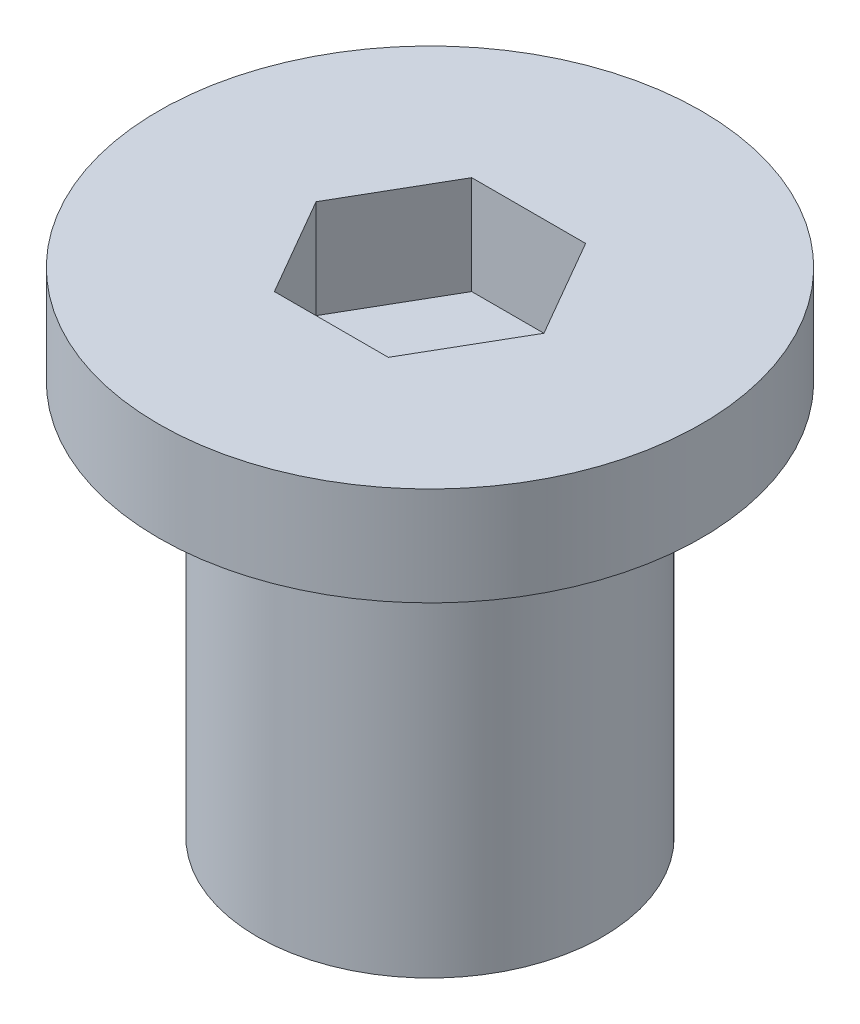
ISO-10303-21;
HEADER;
FILE_DESCRIPTION(('STEP AP214'),'2;1');
FILE_NAME('part.step','',(''),(''),'','','');
FILE_SCHEMA(('AUTOMOTIVE_DESIGN { 1 0 10303 214 1 1 1 1 }'));
ENDSEC;
DATA;
#1=APPLICATION_CONTEXT('core data for automotive mechanical design processes');
#2=APPLICATION_PROTOCOL_DEFINITION('international standard','automotive_design',2000,#1);
#3=PRODUCT_CONTEXT('',#1,'mechanical');
#4=PRODUCT('Part','Part','',(#3));
#5=PRODUCT_RELATED_PRODUCT_CATEGORY('part','',(#4));
#6=PRODUCT_DEFINITION_FORMATION('','',#4);
#7=PRODUCT_DEFINITION_CONTEXT('part definition',#1,'design');
#8=PRODUCT_DEFINITION('design','',#6,#7);
#9=PRODUCT_DEFINITION_SHAPE('','',#8);
#10=(LENGTH_UNIT() NAMED_UNIT(*) SI_UNIT(.MILLI.,.METRE.));
#11=(NAMED_UNIT(*) PLANE_ANGLE_UNIT() SI_UNIT($,.RADIAN.));
#12=(NAMED_UNIT(*) SI_UNIT($,.STERADIAN.) SOLID_ANGLE_UNIT());
#13=UNCERTAINTY_MEASURE_WITH_UNIT(LENGTH_MEASURE(1.E-05),#10,'distance_accuracy_value','');
#14=(GEOMETRIC_REPRESENTATION_CONTEXT(3) GLOBAL_UNCERTAINTY_ASSIGNED_CONTEXT((#13)) GLOBAL_UNIT_ASSIGNED_CONTEXT((#10,
#11,#12)) REPRESENTATION_CONTEXT('',''));
#15=CARTESIAN_POINT('',(0.,0.,0.));
#16=DIRECTION('',(0.,0.,1.));
#17=DIRECTION('',(1.,0.,0.));
#18=AXIS2_PLACEMENT_3D('',#15,#16,#17);
#19=CARTESIAN_POINT('',(0.,2.,0.));
#20=DIRECTION('',(0.,-1.,0.));
#21=DIRECTION('',(0.,0.,-1.));
#22=AXIS2_PLACEMENT_3D('',#19,#20,#21);
#23=CYLINDRICAL_SURFACE('',#22,1.75);
#24=CARTESIAN_POINT('',(0.,2.,0.));
#25=DIRECTION('',(0.,1.,0.));
#26=DIRECTION('',(0.,0.,1.));
#27=AXIS2_PLACEMENT_3D('',#24,#25,#26);
#28=CIRCLE('',#27,1.75);
#29=CARTESIAN_POINT('',(0.,2.,1.75));
#30=VERTEX_POINT('',#29);
#31=EDGE_CURVE('E11',#30,#30,#28,.T.);
#32=ORIENTED_EDGE('',*,*,#31,.F.);
#33=EDGE_LOOP('',(#32));
#34=FACE_BOUND('',#33,.T.);
#35=CARTESIAN_POINT('',(0.,-2.,0.));
#36=DIRECTION('',(0.,1.,0.));
#37=DIRECTION('',(0.,0.,1.));
#38=AXIS2_PLACEMENT_3D('',#35,#36,#37);
#39=CIRCLE('',#38,1.75);
#40=CARTESIAN_POINT('',(0.,-2.,1.75));
#41=VERTEX_POINT('',#40);
#42=EDGE_CURVE('E44',#41,#41,#39,.T.);
#43=ORIENTED_EDGE('',*,*,#42,.T.);
#44=EDGE_LOOP('',(#43));
#45=FACE_BOUND('',#44,.T.);
#46=ADVANCED_FACE('F41',(#34,#45),#23,.T.);
#47=CARTESIAN_POINT('',(0.,-2.,0.));
#48=DIRECTION('',(0.,1.,0.));
#49=DIRECTION('',(0.,0.,1.));
#50=AXIS2_PLACEMENT_3D('',#47,#48,#49);
#51=PLANE('',#50);
#52=ORIENTED_EDGE('',*,*,#42,.F.);
#53=EDGE_LOOP('',(#52));
#54=FACE_BOUND('',#53,.T.);
#55=ADVANCED_FACE('F173',(#54),#51,.F.);
#56=CARTESIAN_POINT('',(0.,3.,0.));
#57=DIRECTION('',(0.,-1.,0.));
#58=DIRECTION('',(0.,0.,-1.));
#59=AXIS2_PLACEMENT_3D('',#56,#57,#58);
#60=CYLINDRICAL_SURFACE('',#59,2.75);
#61=CARTESIAN_POINT('',(0.,3.,0.));
#62=DIRECTION('',(0.,1.,0.));
#63=DIRECTION('',(0.,0.,1.));
#64=AXIS2_PLACEMENT_3D('',#61,#62,#63);
#65=CIRCLE('',#64,2.75);
#66=CARTESIAN_POINT('',(0.,3.,2.75));
#67=VERTEX_POINT('',#66);
#68=EDGE_CURVE('E148',#67,#67,#65,.T.);
#69=ORIENTED_EDGE('',*,*,#68,.F.);
#70=EDGE_LOOP('',(#69));
#71=FACE_BOUND('',#70,.T.);
#72=CARTESIAN_POINT('',(0.,2.,0.));
#73=DIRECTION('',(0.,1.,0.));
#74=DIRECTION('',(0.,0.,1.));
#75=AXIS2_PLACEMENT_3D('',#72,#73,#74);
#76=CIRCLE('',#75,2.75);
#77=CARTESIAN_POINT('',(0.,2.,2.75));
#78=VERTEX_POINT('',#77);
#79=EDGE_CURVE('E142',#78,#78,#76,.T.);
#80=ORIENTED_EDGE('',*,*,#79,.T.);
#81=EDGE_LOOP('',(#80));
#82=FACE_BOUND('',#81,.T.);
#83=ADVANCED_FACE('F154',(#71,#82),#60,.T.);
#84=CARTESIAN_POINT('',(0.,3.,0.));
#85=DIRECTION('',(0.,1.,0.));
#86=DIRECTION('',(0.,0.,1.));
#87=AXIS2_PLACEMENT_3D('',#84,#85,#86);
#88=PLANE('',#87);
#89=DIRECTION('',(0.5,0.,-0.866025403784439));
#90=VECTOR('',#89,1.);
#91=CARTESIAN_POINT('',(0.577350269189626,3.,1.));
#92=LINE('',#91,#90);
#93=CARTESIAN_POINT('',(0.577350269189626,3.,1.));
#94=VERTEX_POINT('',#93);
#95=CARTESIAN_POINT('',(1.15470053837925,3.,0.));
#96=VERTEX_POINT('',#95);
#97=EDGE_CURVE('E55',#94,#96,#92,.T.);
#98=ORIENTED_EDGE('',*,*,#97,.F.);
#99=DIRECTION('',(1.,0.,0.));
#100=VECTOR('',#99,1.);
#101=CARTESIAN_POINT('',(-0.577350269189626,3.,1.));
#102=LINE('',#101,#100);
#103=CARTESIAN_POINT('',(-0.577350269189626,3.,1.));
#104=VERTEX_POINT('',#103);
#105=EDGE_CURVE('E138',#104,#94,#102,.T.);
#106=ORIENTED_EDGE('',*,*,#105,.F.);
#107=DIRECTION('',(0.5,0.,0.866025403784439));
#108=VECTOR('',#107,1.);
#109=CARTESIAN_POINT('',(-1.15470053837925,3.,0.));
#110=LINE('',#109,#108);
#111=CARTESIAN_POINT('',(-1.15470053837925,3.,0.));
#112=VERTEX_POINT('',#111);
#113=EDGE_CURVE('E136',#112,#104,#110,.T.);
#114=ORIENTED_EDGE('',*,*,#113,.F.);
#115=DIRECTION('',(-0.5,0.,0.866025403784439));
#116=VECTOR('',#115,1.);
#117=CARTESIAN_POINT('',(-0.577350269189626,3.,-1.));
#118=LINE('',#117,#116);
#119=CARTESIAN_POINT('',(-0.577350269189626,3.,-1.));
#120=VERTEX_POINT('',#119);
#121=EDGE_CURVE('E103',#120,#112,#118,.T.);
#122=ORIENTED_EDGE('',*,*,#121,.F.);
#123=DIRECTION('',(-1.,0.,0.));
#124=VECTOR('',#123,1.);
#125=CARTESIAN_POINT('',(0.577350269189626,3.,-1.));
#126=LINE('',#125,#124);
#127=CARTESIAN_POINT('',(0.577350269189626,3.,-1.));
#128=VERTEX_POINT('',#127);
#129=EDGE_CURVE('E132',#128,#120,#126,.T.);
#130=ORIENTED_EDGE('',*,*,#129,.F.);
#131=DIRECTION('',(-0.5,0.,-0.866025403784438));
#132=VECTOR('',#131,1.);
#133=CARTESIAN_POINT('',(1.15470053837925,3.,0.));
#134=LINE('',#133,#132);
#135=EDGE_CURVE('E129',#96,#128,#134,.T.);
#136=ORIENTED_EDGE('',*,*,#135,.F.);
#137=EDGE_LOOP('',(#98,#106,#114,#122,#130,#136));
#138=FACE_BOUND('',#137,.T.);
#139=ORIENTED_EDGE('',*,*,#68,.T.);
#140=EDGE_LOOP('',(#139));
#141=FACE_BOUND('',#140,.T.);
#142=ADVANCED_FACE('F159',(#138,#141),#88,.T.);
#143=CARTESIAN_POINT('',(0.,2.,0.));
#144=DIRECTION('',(0.,1.,0.));
#145=DIRECTION('',(0.,0.,1.));
#146=AXIS2_PLACEMENT_3D('',#143,#144,#145);
#147=PLANE('',#146);
#148=ORIENTED_EDGE('',*,*,#31,.T.);
#149=EDGE_LOOP('',(#148));
#150=FACE_BOUND('',#149,.T.);
#151=ORIENTED_EDGE('',*,*,#79,.F.);
#152=EDGE_LOOP('',(#151));
#153=FACE_BOUND('',#152,.T.);
#154=ADVANCED_FACE('F156',(#150,#153),#147,.F.);
#155=CARTESIAN_POINT('',(0.577350269189626,2.,1.));
#156=DIRECTION('',(0.866025403784439,0.,0.5));
#157=DIRECTION('',(0.5,0.,-0.866025403784439));
#158=AXIS2_PLACEMENT_3D('',#155,#156,#157);
#159=PLANE('',#158);
#160=ORIENTED_EDGE('',*,*,#97,.T.);
#161=DIRECTION('',(0.,1.,0.));
#162=VECTOR('',#161,1.);
#163=CARTESIAN_POINT('',(1.15470053837925,2.,0.));
#164=LINE('',#163,#162);
#165=CARTESIAN_POINT('',(1.15470053837925,2.,0.));
#166=VERTEX_POINT('',#165);
#167=EDGE_CURVE('E85',#166,#96,#164,.T.);
#168=ORIENTED_EDGE('',*,*,#167,.F.);
#169=DIRECTION('',(0.5,0.,-0.866025403784439));
#170=VECTOR('',#169,1.);
#171=CARTESIAN_POINT('',(0.577350269189626,2.,1.));
#172=LINE('',#171,#170);
#173=CARTESIAN_POINT('',(0.577350269189626,2.,1.));
#174=VERTEX_POINT('',#173);
#175=EDGE_CURVE('E140',#174,#166,#172,.T.);
#176=ORIENTED_EDGE('',*,*,#175,.F.);
#177=DIRECTION('',(0.,1.,0.));
#178=VECTOR('',#177,1.);
#179=CARTESIAN_POINT('',(0.577350269189626,2.,1.));
#180=LINE('',#179,#178);
#181=EDGE_CURVE('E63',#174,#94,#180,.T.);
#182=ORIENTED_EDGE('',*,*,#181,.T.);
#183=EDGE_LOOP('',(#160,#168,#176,#182));
#184=FACE_BOUND('',#183,.T.);
#185=ADVANCED_FACE('F158',(#184),#159,.F.);
#186=CARTESIAN_POINT('',(-0.577350269189626,2.,1.));
#187=DIRECTION('',(0.,0.,1.));
#188=DIRECTION('',(1.,0.,0.));
#189=AXIS2_PLACEMENT_3D('',#186,#187,#188);
#190=PLANE('',#189);
#191=ORIENTED_EDGE('',*,*,#105,.T.);
#192=ORIENTED_EDGE('',*,*,#181,.F.);
#193=DIRECTION('',(1.,0.,0.));
#194=VECTOR('',#193,1.);
#195=CARTESIAN_POINT('',(-0.577350269189626,2.,1.));
#196=LINE('',#195,#194);
#197=CARTESIAN_POINT('',(-0.577350269189626,2.,1.));
#198=VERTEX_POINT('',#197);
#199=EDGE_CURVE('E115',#198,#174,#196,.T.);
#200=ORIENTED_EDGE('',*,*,#199,.F.);
#201=DIRECTION('',(0.,1.,0.));
#202=VECTOR('',#201,1.);
#203=CARTESIAN_POINT('',(-0.577350269189626,2.,1.));
#204=LINE('',#203,#202);
#205=EDGE_CURVE('E107',#198,#104,#204,.T.);
#206=ORIENTED_EDGE('',*,*,#205,.T.);
#207=EDGE_LOOP('',(#191,#192,#200,#206));
#208=FACE_BOUND('',#207,.T.);
#209=ADVANCED_FACE('F167',(#208),#190,.F.);
#210=CARTESIAN_POINT('',(-1.15470053837925,2.,0.));
#211=DIRECTION('',(-0.866025403784439,0.,0.5));
#212=DIRECTION('',(0.5,0.,0.866025403784439));
#213=AXIS2_PLACEMENT_3D('',#210,#211,#212);
#214=PLANE('',#213);
#215=ORIENTED_EDGE('',*,*,#113,.T.);
#216=ORIENTED_EDGE('',*,*,#205,.F.);
#217=DIRECTION('',(0.5,0.,0.866025403784439));
#218=VECTOR('',#217,1.);
#219=CARTESIAN_POINT('',(-1.15470053837925,2.,0.));
#220=LINE('',#219,#218);
#221=CARTESIAN_POINT('',(-1.15470053837925,2.,0.));
#222=VERTEX_POINT('',#221);
#223=EDGE_CURVE('E111',#222,#198,#220,.T.);
#224=ORIENTED_EDGE('',*,*,#223,.F.);
#225=DIRECTION('',(0.,1.,0.));
#226=VECTOR('',#225,1.);
#227=CARTESIAN_POINT('',(-1.15470053837925,2.,0.));
#228=LINE('',#227,#226);
#229=EDGE_CURVE('E96',#222,#112,#228,.T.);
#230=ORIENTED_EDGE('',*,*,#229,.T.);
#231=EDGE_LOOP('',(#215,#216,#224,#230));
#232=FACE_BOUND('',#231,.T.);
#233=ADVANCED_FACE('F112',(#232),#214,.F.);
#234=CARTESIAN_POINT('',(-0.577350269189626,2.,-1.));
#235=DIRECTION('',(-0.866025403784439,0.,-0.5));
#236=DIRECTION('',(-0.5,0.,0.866025403784439));
#237=AXIS2_PLACEMENT_3D('',#234,#235,#236);
#238=PLANE('',#237);
#239=ORIENTED_EDGE('',*,*,#121,.T.);
#240=ORIENTED_EDGE('',*,*,#229,.F.);
#241=DIRECTION('',(-0.5,0.,0.866025403784439));
#242=VECTOR('',#241,1.);
#243=CARTESIAN_POINT('',(-0.577350269189626,2.,-1.));
#244=LINE('',#243,#242);
#245=CARTESIAN_POINT('',(-0.577350269189626,2.,-1.));
#246=VERTEX_POINT('',#245);
#247=EDGE_CURVE('E100',#246,#222,#244,.T.);
#248=ORIENTED_EDGE('',*,*,#247,.F.);
#249=DIRECTION('',(0.,1.,0.));
#250=VECTOR('',#249,1.);
#251=CARTESIAN_POINT('',(-0.577350269189626,2.,-1.));
#252=LINE('',#251,#250);
#253=EDGE_CURVE('E108',#246,#120,#252,.T.);
#254=ORIENTED_EDGE('',*,*,#253,.T.);
#255=EDGE_LOOP('',(#239,#240,#248,#254));
#256=FACE_BOUND('',#255,.T.);
#257=ADVANCED_FACE('F98',(#256),#238,.F.);
#258=CARTESIAN_POINT('',(0.577350269189626,2.,-1.));
#259=DIRECTION('',(0.,0.,-1.));
#260=DIRECTION('',(-1.,0.,0.));
#261=AXIS2_PLACEMENT_3D('',#258,#259,#260);
#262=PLANE('',#261);
#263=ORIENTED_EDGE('',*,*,#129,.T.);
#264=ORIENTED_EDGE('',*,*,#253,.F.);
#265=DIRECTION('',(-1.,0.,0.));
#266=VECTOR('',#265,1.);
#267=CARTESIAN_POINT('',(0.577350269189626,2.,-1.));
#268=LINE('',#267,#266);
#269=CARTESIAN_POINT('',(0.577350269189626,2.,-1.));
#270=VERTEX_POINT('',#269);
#271=EDGE_CURVE('E121',#270,#246,#268,.T.);
#272=ORIENTED_EDGE('',*,*,#271,.F.);
#273=DIRECTION('',(0.,1.,0.));
#274=VECTOR('',#273,1.);
#275=CARTESIAN_POINT('',(0.577350269189626,2.,-1.));
#276=LINE('',#275,#274);
#277=EDGE_CURVE('E145',#270,#128,#276,.T.);
#278=ORIENTED_EDGE('',*,*,#277,.T.);
#279=EDGE_LOOP('',(#263,#264,#272,#278));
#280=FACE_BOUND('',#279,.T.);
#281=ADVANCED_FACE('F235',(#280),#262,.F.);
#282=CARTESIAN_POINT('',(1.15470053837925,2.,0.));
#283=DIRECTION('',(0.866025403784439,0.,-0.5));
#284=DIRECTION('',(-0.5,0.,-0.866025403784438));
#285=AXIS2_PLACEMENT_3D('',#282,#283,#284);
#286=PLANE('',#285);
#287=ORIENTED_EDGE('',*,*,#135,.T.);
#288=ORIENTED_EDGE('',*,*,#277,.F.);
#289=DIRECTION('',(-0.5,0.,-0.866025403784438));
#290=VECTOR('',#289,1.);
#291=CARTESIAN_POINT('',(1.15470053837925,2.,0.));
#292=LINE('',#291,#290);
#293=EDGE_CURVE('E123',#166,#270,#292,.T.);
#294=ORIENTED_EDGE('',*,*,#293,.F.);
#295=ORIENTED_EDGE('',*,*,#167,.T.);
#296=EDGE_LOOP('',(#287,#288,#294,#295));
#297=FACE_BOUND('',#296,.T.);
#298=ADVANCED_FACE('F244',(#297),#286,.F.);
#299=CARTESIAN_POINT('',(0.,2.,0.));
#300=DIRECTION('',(0.,1.,0.));
#301=DIRECTION('',(0.,0.,1.));
#302=AXIS2_PLACEMENT_3D('',#299,#300,#301);
#303=PLANE('',#302);
#304=ORIENTED_EDGE('',*,*,#175,.T.);
#305=ORIENTED_EDGE('',*,*,#293,.T.);
#306=ORIENTED_EDGE('',*,*,#271,.T.);
#307=ORIENTED_EDGE('',*,*,#247,.T.);
#308=ORIENTED_EDGE('',*,*,#223,.T.);
#309=ORIENTED_EDGE('',*,*,#199,.T.);
#310=EDGE_LOOP('',(#304,#305,#306,#307,#308,#309));
#311=FACE_BOUND('',#310,.T.);
#312=ADVANCED_FACE('F118',(#311),#303,.T.);
#313=CLOSED_SHELL('',(#46,#55,#83,#142,#154,#185,#209,#233,#257,#281,#298,#312));
#314=MANIFOLD_SOLID_BREP('B2',#313);
#315=ADVANCED_BREP_SHAPE_REPRESENTATION('',(#18,#314),#14);
#316=SHAPE_DEFINITION_REPRESENTATION(#9,#315);
ENDSEC;
END-ISO-10303-21;
